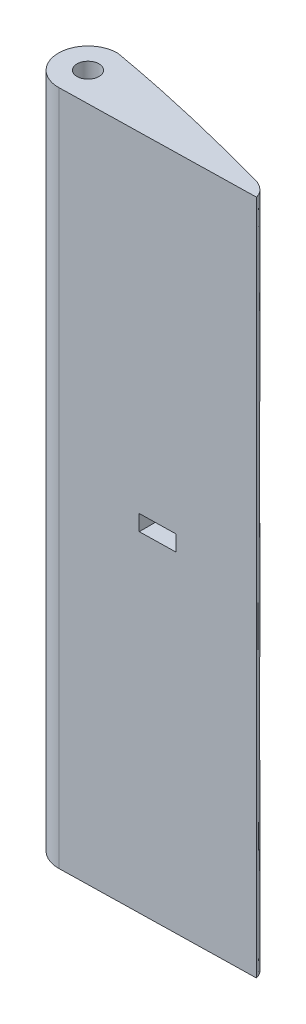
ISO-10303-21;
HEADER;
FILE_DESCRIPTION(('STEP AP214'),'2;1');
FILE_NAME('part.step','',(''),(''),'','','');
FILE_SCHEMA(('AUTOMOTIVE_DESIGN { 1 0 10303 214 1 1 1 1 }'));
ENDSEC;
DATA;
#1=APPLICATION_CONTEXT('core data for automotive mechanical design processes');
#2=APPLICATION_PROTOCOL_DEFINITION('international standard','automotive_design',2000,#1);
#3=PRODUCT_CONTEXT('',#1,'mechanical');
#4=PRODUCT('Part','Part','',(#3));
#5=PRODUCT_RELATED_PRODUCT_CATEGORY('part','',(#4));
#6=PRODUCT_DEFINITION_FORMATION('','',#4);
#7=PRODUCT_DEFINITION_CONTEXT('part definition',#1,'design');
#8=PRODUCT_DEFINITION('design','',#6,#7);
#9=PRODUCT_DEFINITION_SHAPE('','',#8);
#10=(LENGTH_UNIT() NAMED_UNIT(*) SI_UNIT(.MILLI.,.METRE.));
#11=(NAMED_UNIT(*) PLANE_ANGLE_UNIT() SI_UNIT($,.RADIAN.));
#12=(NAMED_UNIT(*) SI_UNIT($,.STERADIAN.) SOLID_ANGLE_UNIT());
#13=UNCERTAINTY_MEASURE_WITH_UNIT(LENGTH_MEASURE(1.E-05),#10,'distance_accuracy_value','');
#14=(GEOMETRIC_REPRESENTATION_CONTEXT(3) GLOBAL_UNCERTAINTY_ASSIGNED_CONTEXT((#13)) GLOBAL_UNIT_ASSIGNED_CONTEXT((#10,
#11,#12)) REPRESENTATION_CONTEXT('',''));
#15=CARTESIAN_POINT('',(0.,0.,0.));
#16=DIRECTION('',(0.,0.,1.));
#17=DIRECTION('',(1.,0.,0.));
#18=AXIS2_PLACEMENT_3D('',#15,#16,#17);
#19=CARTESIAN_POINT('',(94.9026760983729,109.22,1.53993694946392));
#20=DIRECTION('',(-0.020309244052753,0.,-0.999793746032653));
#21=DIRECTION('',(-0.999793746032653,0.,0.020309244052753));
#22=AXIS2_PLACEMENT_3D('',#19,#20,#21);
#23=PLANE('',#22);
#24=DIRECTION('',(0.999793746032653,0.,-0.020309244052753));
#25=VECTOR('',#24,1.);
#26=CARTESIAN_POINT('',(94.9026760983729,0.,1.53993694946392));
#27=LINE('',#26,#25);
#28=CARTESIAN_POINT('',(94.9026760983729,0.,1.53993694946392));
#29=VERTEX_POINT('',#28);
#30=CARTESIAN_POINT('',(126.153699605927,0.,0.905121352915351));
#31=VERTEX_POINT('',#30);
#32=EDGE_CURVE('E220',#29,#31,#27,.T.);
#33=ORIENTED_EDGE('',*,*,#32,.T.);
#34=DIRECTION('',(0.,-1.,0.));
#35=VECTOR('',#34,1.);
#36=CARTESIAN_POINT('',(126.153699605927,109.22,0.905121352915351));
#37=LINE('',#36,#35);
#38=CARTESIAN_POINT('',(126.153699605927,109.22,0.905121352915351));
#39=VERTEX_POINT('',#38);
#40=EDGE_CURVE('E224',#39,#31,#37,.T.);
#41=ORIENTED_EDGE('',*,*,#40,.F.);
#42=DIRECTION('',(0.999793746032653,0.,-0.020309244052753));
#43=VECTOR('',#42,1.);
#44=CARTESIAN_POINT('',(94.9026760983729,109.22,1.53993694946392));
#45=LINE('',#44,#43);
#46=CARTESIAN_POINT('',(94.9026760983729,109.22,1.53993694946392));
#47=VERTEX_POINT('',#46);
#48=EDGE_CURVE('E177',#47,#39,#45,.T.);
#49=ORIENTED_EDGE('',*,*,#48,.F.);
#50=DIRECTION('',(0.,-1.,0.));
#51=VECTOR('',#50,1.);
#52=CARTESIAN_POINT('',(94.9026760983729,109.22,1.53993694946392));
#53=LINE('',#52,#51);
#54=EDGE_CURVE('E211',#47,#29,#53,.T.);
#55=ORIENTED_EDGE('',*,*,#54,.T.);
#56=EDGE_LOOP('',(#33,#41,#49,#55));
#57=FACE_BOUND('',#56,.T.);
#58=DIRECTION('',(0.999793746032653,0.,-0.020309244052753));
#59=VECTOR('',#58,1.);
#60=CARTESIAN_POINT('',(94.9026760983729,53.34,1.53993694946392));
#61=LINE('',#60,#59);
#62=CARTESIAN_POINT('',(107.60718785215,53.34,1.28186469125827));
#63=VERTEX_POINT('',#62);
#64=CARTESIAN_POINT('',(113.44918785215,53.34,1.163193611121));
#65=VERTEX_POINT('',#64);
#66=EDGE_CURVE('E11',#63,#65,#61,.T.);
#67=ORIENTED_EDGE('',*,*,#66,.F.);
#68=DIRECTION('',(0.,-1.,0.));
#69=VECTOR('',#68,1.);
#70=CARTESIAN_POINT('',(107.60718785215,109.22,1.28186469125827));
#71=LINE('',#70,#69);
#72=CARTESIAN_POINT('',(107.60718785215,55.88,1.28186469125827));
#73=VERTEX_POINT('',#72);
#74=EDGE_CURVE('E55',#73,#63,#71,.T.);
#75=ORIENTED_EDGE('',*,*,#74,.F.);
#76=DIRECTION('',(0.999793746032653,0.,-0.020309244052753));
#77=VECTOR('',#76,1.);
#78=CARTESIAN_POINT('',(94.9026760983729,55.88,1.53993694946392));
#79=LINE('',#78,#77);
#80=CARTESIAN_POINT('',(113.44918785215,55.88,1.163193611121));
#81=VERTEX_POINT('',#80);
#82=EDGE_CURVE('E246',#73,#81,#79,.T.);
#83=ORIENTED_EDGE('',*,*,#82,.T.);
#84=DIRECTION('',(0.,-1.,0.));
#85=VECTOR('',#84,1.);
#86=CARTESIAN_POINT('',(113.44918785215,109.22,1.163193611121));
#87=LINE('',#86,#85);
#88=EDGE_CURVE('E243',#81,#65,#87,.T.);
#89=ORIENTED_EDGE('',*,*,#88,.T.);
#90=EDGE_LOOP('',(#67,#75,#83,#89));
#91=FACE_BOUND('',#90,.T.);
#92=ADVANCED_FACE('F45',(#57,#91),#23,.F.);
#93=CARTESIAN_POINT('',(109.604666146539,109.22,-4.99935229992411));
#94=DIRECTION('',(0.,1.,0.));
#95=DIRECTION('',(0.,0.,1.));
#96=AXIS2_PLACEMENT_3D('',#93,#94,#95);
#97=PLANE('',#96);
#98=CARTESIAN_POINT('',(124.233327419865,109.22,-1.22065843847954));
#99=CARTESIAN_POINT('',(114.540546966055,109.22,-3.95993526353202));
#100=CARTESIAN_POINT('',(104.725661305525,109.22,-6.28450610690063));
#101=CARTESIAN_POINT('',(94.8053769377087,109.22,-8.04083584961535));
#102=B_SPLINE_CURVE_WITH_KNOTS('',3,(#98,#99,#100,#101),.UNSPECIFIED.,.F.,.F.,(4,4),(0.,1.),.UNSPECIFIED.);
#103=CARTESIAN_POINT('',(124.233327419865,109.22,-1.22065843847954));
#104=VERTEX_POINT('',#103);
#105=CARTESIAN_POINT('',(94.8053769377087,109.22,-8.04083584961535));
#106=VERTEX_POINT('',#105);
#107=EDGE_CURVE('E166',#104,#106,#102,.T.);
#108=ORIENTED_EDGE('',*,*,#107,.T.);
#109=CARTESIAN_POINT('',(94.8053769377087,109.22,-3.24995538102385));
#110=DIRECTION('',(0.,1.,0.));
#111=DIRECTION('',(0.,0.,1.));
#112=AXIS2_PLACEMENT_3D('',#109,#110,#111);
#113=CIRCLE('',#112,4.7908804685915);
#114=EDGE_CURVE('E99',#106,#47,#113,.T.);
#115=ORIENTED_EDGE('',*,*,#114,.T.);
#116=ORIENTED_EDGE('',*,*,#48,.T.);
#117=CARTESIAN_POINT('',(126.153699605927,109.22,0.905121352915351));
#118=CARTESIAN_POINT('',(125.965467473234,109.22,-0.0882022750494008));
#119=CARTESIAN_POINT('',(125.083825561737,109.22,-0.79373392774819));
#120=CARTESIAN_POINT('',(124.233327419865,109.22,-1.22065843847954));
#121=B_SPLINE_CURVE_WITH_KNOTS('',3,(#117,#118,#119,#120),.UNSPECIFIED.,.F.,.F.,(4,4),(0.,1.),.UNSPECIFIED.);
#122=EDGE_CURVE('E70',#39,#104,#121,.T.);
#123=ORIENTED_EDGE('',*,*,#122,.T.);
#124=EDGE_LOOP('',(#108,#115,#116,#123));
#125=FACE_BOUND('',#124,.T.);
#126=CARTESIAN_POINT('',(94.8053769377087,109.22,-3.24995538102385));
#127=DIRECTION('',(0.,1.,0.));
#128=DIRECTION('',(0.,0.,1.));
#129=AXIS2_PLACEMENT_3D('',#126,#127,#128);
#130=CIRCLE('',#129,1.77799999999999);
#131=CARTESIAN_POINT('',(94.8053769377087,109.22,-1.47195538102386));
#132=VERTEX_POINT('',#131);
#133=EDGE_CURVE('E159',#132,#132,#130,.T.);
#134=ORIENTED_EDGE('',*,*,#133,.F.);
#135=EDGE_LOOP('',(#134));
#136=FACE_BOUND('',#135,.T.);
#137=ADVANCED_FACE('F202',(#125,#136),#97,.T.);
#138=CARTESIAN_POINT('',(109.604666146539,0.,-4.99935229992411));
#139=DIRECTION('',(0.,1.,0.));
#140=DIRECTION('',(0.,0.,1.));
#141=AXIS2_PLACEMENT_3D('',#138,#139,#140);
#142=PLANE('',#141);
#143=CARTESIAN_POINT('',(124.233327419865,0.,-1.22065843847954));
#144=CARTESIAN_POINT('',(114.540546966055,0.,-3.95993526353202));
#145=CARTESIAN_POINT('',(104.725661305525,0.,-6.28450610690063));
#146=CARTESIAN_POINT('',(94.8053769377087,0.,-8.04083584961535));
#147=B_SPLINE_CURVE_WITH_KNOTS('',3,(#143,#144,#145,#146),.UNSPECIFIED.,.F.,.F.,(4,4),(0.,1.),.UNSPECIFIED.);
#148=CARTESIAN_POINT('',(124.233327419865,0.,-1.22065843847954));
#149=VERTEX_POINT('',#148);
#150=CARTESIAN_POINT('',(94.8053769377087,0.,-8.04083584961535));
#151=VERTEX_POINT('',#150);
#152=EDGE_CURVE('E163',#149,#151,#147,.T.);
#153=ORIENTED_EDGE('',*,*,#152,.F.);
#154=CARTESIAN_POINT('',(126.153699605927,0.,0.905121352915351));
#155=CARTESIAN_POINT('',(125.965467473234,0.,-0.0882022750494008));
#156=CARTESIAN_POINT('',(125.083825561737,0.,-0.79373392774819));
#157=CARTESIAN_POINT('',(124.233327419865,0.,-1.22065843847954));
#158=B_SPLINE_CURVE_WITH_KNOTS('',3,(#154,#155,#156,#157),.UNSPECIFIED.,.F.,.F.,(4,4),(0.,1.),.UNSPECIFIED.);
#159=EDGE_CURVE('E91',#31,#149,#158,.T.);
#160=ORIENTED_EDGE('',*,*,#159,.F.);
#161=ORIENTED_EDGE('',*,*,#32,.F.);
#162=CARTESIAN_POINT('',(94.8053769377087,0.,-3.24995538102385));
#163=DIRECTION('',(0.,1.,0.));
#164=DIRECTION('',(0.,0.,1.));
#165=AXIS2_PLACEMENT_3D('',#162,#163,#164);
#166=CIRCLE('',#165,4.7908804685915);
#167=EDGE_CURVE('E209',#151,#29,#166,.T.);
#168=ORIENTED_EDGE('',*,*,#167,.F.);
#169=EDGE_LOOP('',(#153,#160,#161,#168));
#170=FACE_BOUND('',#169,.T.);
#171=CARTESIAN_POINT('',(94.8053769377087,0.,-3.24995538102385));
#172=DIRECTION('',(0.,1.,0.));
#173=DIRECTION('',(0.,0.,1.));
#174=AXIS2_PLACEMENT_3D('',#171,#172,#173);
#175=CIRCLE('',#174,1.77799999999999);
#176=CARTESIAN_POINT('',(94.8053769377087,0.,-1.47195538102386));
#177=VERTEX_POINT('',#176);
#178=EDGE_CURVE('E152',#177,#177,#175,.T.);
#179=ORIENTED_EDGE('',*,*,#178,.T.);
#180=EDGE_LOOP('',(#179));
#181=FACE_BOUND('',#180,.T.);
#182=ADVANCED_FACE('F199',(#170,#181),#142,.F.);
#183=DIRECTION('',(0.,-1.,0.));
#184=VECTOR('',#183,1.);
#185=SURFACE_OF_LINEAR_EXTRUSION('',#102,#184);
#186=ORIENTED_EDGE('',*,*,#152,.T.);
#187=DIRECTION('',(0.,-1.,0.));
#188=VECTOR('',#187,1.);
#189=CARTESIAN_POINT('',(94.8053769377087,109.22,-8.04083584961535));
#190=LINE('',#189,#188);
#191=EDGE_CURVE('E214',#106,#151,#190,.T.);
#192=ORIENTED_EDGE('',*,*,#191,.F.);
#193=ORIENTED_EDGE('',*,*,#107,.F.);
#194=DIRECTION('',(0.,-1.,0.));
#195=VECTOR('',#194,1.);
#196=CARTESIAN_POINT('',(124.233327419865,109.22,-1.22065843847954));
#197=LINE('',#196,#195);
#198=EDGE_CURVE('E185',#104,#149,#197,.T.);
#199=ORIENTED_EDGE('',*,*,#198,.T.);
#200=EDGE_LOOP('',(#186,#192,#193,#199));
#201=FACE_BOUND('',#200,.T.);
#202=ADVANCED_FACE('F47',(#201),#185,.F.);
#203=CARTESIAN_POINT('',(94.8053769377087,109.22,-3.24995538102385));
#204=DIRECTION('',(0.,-1.,0.));
#205=DIRECTION('',(0.,0.,-1.));
#206=AXIS2_PLACEMENT_3D('',#203,#204,#205);
#207=CYLINDRICAL_SURFACE('',#206,4.7908804685915);
#208=ORIENTED_EDGE('',*,*,#167,.T.);
#209=ORIENTED_EDGE('',*,*,#54,.F.);
#210=ORIENTED_EDGE('',*,*,#114,.F.);
#211=ORIENTED_EDGE('',*,*,#191,.T.);
#212=EDGE_LOOP('',(#208,#209,#210,#211));
#213=FACE_BOUND('',#212,.T.);
#214=ADVANCED_FACE('F198',(#213),#207,.T.);
#215=DIRECTION('',(0.,-1.,0.));
#216=VECTOR('',#215,1.);
#217=SURFACE_OF_LINEAR_EXTRUSION('',#121,#216);
#218=ORIENTED_EDGE('',*,*,#159,.T.);
#219=ORIENTED_EDGE('',*,*,#198,.F.);
#220=ORIENTED_EDGE('',*,*,#122,.F.);
#221=ORIENTED_EDGE('',*,*,#40,.T.);
#222=EDGE_LOOP('',(#218,#219,#220,#221));
#223=FACE_BOUND('',#222,.T.);
#224=ADVANCED_FACE('F193',(#223),#217,.F.);
#225=CARTESIAN_POINT('',(94.8053769377087,109.22,-3.24995538102385));
#226=DIRECTION('',(0.,-1.,0.));
#227=DIRECTION('',(0.,0.,-1.));
#228=AXIS2_PLACEMENT_3D('',#225,#226,#227);
#229=CYLINDRICAL_SURFACE('',#228,1.77799999999999);
#230=ORIENTED_EDGE('',*,*,#133,.T.);
#231=EDGE_LOOP('',(#230));
#232=FACE_BOUND('',#231,.T.);
#233=ORIENTED_EDGE('',*,*,#178,.F.);
#234=EDGE_LOOP('',(#233));
#235=FACE_BOUND('',#234,.T.);
#236=ADVANCED_FACE('F197',(#232,#235),#229,.F.);
#237=CARTESIAN_POINT('',(0.,53.34,-3.302));
#238=DIRECTION('',(0.,1.,0.));
#239=DIRECTION('',(0.,0.,1.));
#240=AXIS2_PLACEMENT_3D('',#237,#238,#239);
#241=PLANE('',#240);
#242=ORIENTED_EDGE('',*,*,#66,.T.);
#243=DIRECTION('',(0.,0.,1.));
#244=VECTOR('',#243,1.);
#245=CARTESIAN_POINT('',(113.44918785215,53.34,-3.302));
#246=LINE('',#245,#244);
#247=CARTESIAN_POINT('',(113.44918785215,53.34,-3.302));
#248=VERTEX_POINT('',#247);
#249=EDGE_CURVE('E62',#248,#65,#246,.T.);
#250=ORIENTED_EDGE('',*,*,#249,.F.);
#251=DIRECTION('',(-1.,0.,0.));
#252=VECTOR('',#251,1.);
#253=CARTESIAN_POINT('',(0.,53.34,-3.302));
#254=LINE('',#253,#252);
#255=CARTESIAN_POINT('',(107.60718785215,53.34,-3.302));
#256=VERTEX_POINT('',#255);
#257=EDGE_CURVE('E123',#248,#256,#254,.T.);
#258=ORIENTED_EDGE('',*,*,#257,.T.);
#259=DIRECTION('',(0.,0.,1.));
#260=VECTOR('',#259,1.);
#261=CARTESIAN_POINT('',(107.60718785215,53.34,-3.302));
#262=LINE('',#261,#260);
#263=EDGE_CURVE('E149',#256,#63,#262,.T.);
#264=ORIENTED_EDGE('',*,*,#263,.T.);
#265=EDGE_LOOP('',(#242,#250,#258,#264));
#266=FACE_BOUND('',#265,.T.);
#267=ADVANCED_FACE('F121',(#266),#241,.T.);
#268=CARTESIAN_POINT('',(107.60718785215,0.,-3.302));
#269=DIRECTION('',(1.,0.,0.));
#270=DIRECTION('',(0.,0.,-1.));
#271=AXIS2_PLACEMENT_3D('',#268,#269,#270);
#272=PLANE('',#271);
#273=ORIENTED_EDGE('',*,*,#74,.T.);
#274=ORIENTED_EDGE('',*,*,#263,.F.);
#275=DIRECTION('',(0.,1.,0.));
#276=VECTOR('',#275,1.);
#277=CARTESIAN_POINT('',(107.60718785215,0.,-3.302));
#278=LINE('',#277,#276);
#279=CARTESIAN_POINT('',(107.60718785215,55.88,-3.302));
#280=VERTEX_POINT('',#279);
#281=EDGE_CURVE('E129',#256,#280,#278,.T.);
#282=ORIENTED_EDGE('',*,*,#281,.T.);
#283=DIRECTION('',(0.,0.,1.));
#284=VECTOR('',#283,1.);
#285=CARTESIAN_POINT('',(107.60718785215,55.88,-3.302));
#286=LINE('',#285,#284);
#287=EDGE_CURVE('E153',#280,#73,#286,.T.);
#288=ORIENTED_EDGE('',*,*,#287,.T.);
#289=EDGE_LOOP('',(#273,#274,#282,#288));
#290=FACE_BOUND('',#289,.T.);
#291=ADVANCED_FACE('F252',(#290),#272,.T.);
#292=CARTESIAN_POINT('',(0.,55.88,-3.302));
#293=DIRECTION('',(0.,1.,0.));
#294=DIRECTION('',(0.,0.,1.));
#295=AXIS2_PLACEMENT_3D('',#292,#293,#294);
#296=PLANE('',#295);
#297=ORIENTED_EDGE('',*,*,#287,.F.);
#298=DIRECTION('',(-1.,0.,0.));
#299=VECTOR('',#298,1.);
#300=CARTESIAN_POINT('',(0.,55.88,-3.302));
#301=LINE('',#300,#299);
#302=CARTESIAN_POINT('',(113.44918785215,55.88,-3.302));
#303=VERTEX_POINT('',#302);
#304=EDGE_CURVE('E142',#303,#280,#301,.T.);
#305=ORIENTED_EDGE('',*,*,#304,.F.);
#306=DIRECTION('',(0.,0.,1.));
#307=VECTOR('',#306,1.);
#308=CARTESIAN_POINT('',(113.44918785215,55.88,-3.302));
#309=LINE('',#308,#307);
#310=EDGE_CURVE('E128',#303,#81,#309,.T.);
#311=ORIENTED_EDGE('',*,*,#310,.T.);
#312=ORIENTED_EDGE('',*,*,#82,.F.);
#313=EDGE_LOOP('',(#297,#305,#311,#312));
#314=FACE_BOUND('',#313,.T.);
#315=ADVANCED_FACE('F255',(#314),#296,.F.);
#316=CARTESIAN_POINT('',(113.44918785215,0.,-3.302));
#317=DIRECTION('',(1.,0.,0.));
#318=DIRECTION('',(0.,0.,-1.));
#319=AXIS2_PLACEMENT_3D('',#316,#317,#318);
#320=PLANE('',#319);
#321=ORIENTED_EDGE('',*,*,#310,.F.);
#322=DIRECTION('',(0.,1.,0.));
#323=VECTOR('',#322,1.);
#324=CARTESIAN_POINT('',(113.44918785215,0.,-3.302));
#325=LINE('',#324,#323);
#326=EDGE_CURVE('E135',#248,#303,#325,.T.);
#327=ORIENTED_EDGE('',*,*,#326,.F.);
#328=ORIENTED_EDGE('',*,*,#249,.T.);
#329=ORIENTED_EDGE('',*,*,#88,.F.);
#330=EDGE_LOOP('',(#321,#327,#328,#329));
#331=FACE_BOUND('',#330,.T.);
#332=ADVANCED_FACE('F138',(#331),#320,.F.);
#333=CARTESIAN_POINT('',(0.,0.,-3.302));
#334=DIRECTION('',(0.,0.,1.));
#335=DIRECTION('',(1.,0.,0.));
#336=AXIS2_PLACEMENT_3D('',#333,#334,#335);
#337=PLANE('',#336);
#338=ORIENTED_EDGE('',*,*,#257,.F.);
#339=ORIENTED_EDGE('',*,*,#326,.T.);
#340=ORIENTED_EDGE('',*,*,#304,.T.);
#341=ORIENTED_EDGE('',*,*,#281,.F.);
#342=EDGE_LOOP('',(#338,#339,#340,#341));
#343=FACE_BOUND('',#342,.T.);
#344=ADVANCED_FACE('F133',(#343),#337,.T.);
#345=CLOSED_SHELL('',(#92,#137,#182,#202,#214,#224,#236,#267,#291,#315,#332,#344));
#346=MANIFOLD_SOLID_BREP('B2',#345);
#347=ADVANCED_BREP_SHAPE_REPRESENTATION('',(#18,#346),#14);
#348=SHAPE_DEFINITION_REPRESENTATION(#9,#347);
ENDSEC;
END-ISO-10303-21;
